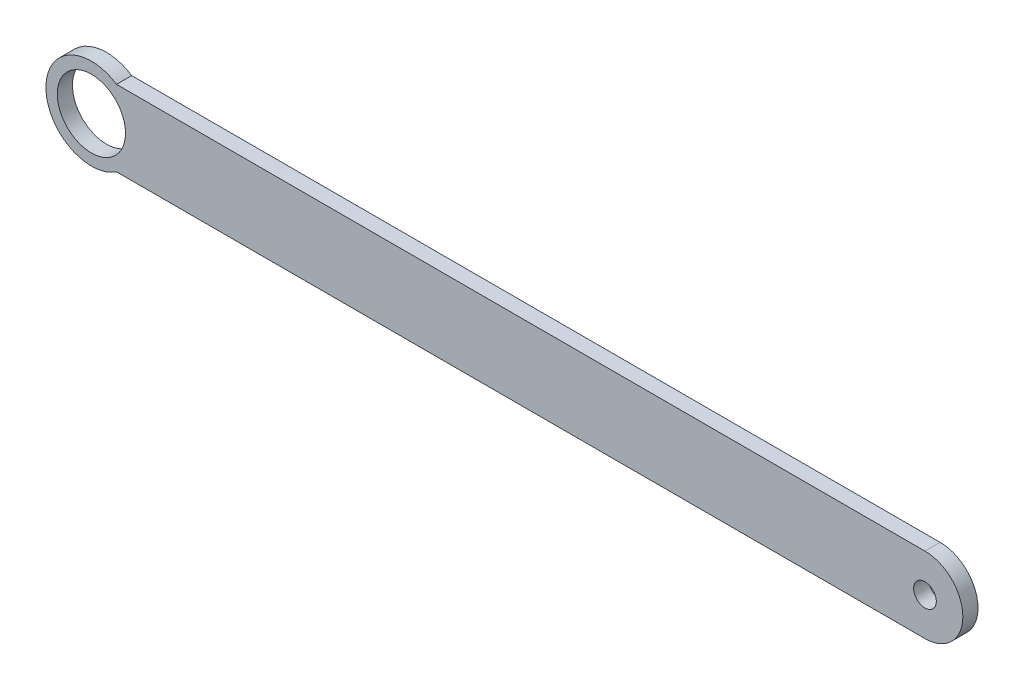
ISO-10303-21;
HEADER;
FILE_DESCRIPTION(('STEP AP214'),'2;1');
FILE_NAME('part.step','',(''),(''),'','','');
FILE_SCHEMA(('AUTOMOTIVE_DESIGN { 1 0 10303 214 1 1 1 1 }'));
ENDSEC;
DATA;
#1=APPLICATION_CONTEXT('core data for automotive mechanical design processes');
#2=APPLICATION_PROTOCOL_DEFINITION('international standard','automotive_design',2000,#1);
#3=PRODUCT_CONTEXT('',#1,'mechanical');
#4=PRODUCT('Part','Part','',(#3));
#5=PRODUCT_RELATED_PRODUCT_CATEGORY('part','',(#4));
#6=PRODUCT_DEFINITION_FORMATION('','',#4);
#7=PRODUCT_DEFINITION_CONTEXT('part definition',#1,'design');
#8=PRODUCT_DEFINITION('design','',#6,#7);
#9=PRODUCT_DEFINITION_SHAPE('','',#8);
#10=(LENGTH_UNIT() NAMED_UNIT(*) SI_UNIT(.MILLI.,.METRE.));
#11=(NAMED_UNIT(*) PLANE_ANGLE_UNIT() SI_UNIT($,.RADIAN.));
#12=(NAMED_UNIT(*) SI_UNIT($,.STERADIAN.) SOLID_ANGLE_UNIT());
#13=UNCERTAINTY_MEASURE_WITH_UNIT(LENGTH_MEASURE(1.E-05),#10,'distance_accuracy_value','');
#14=(GEOMETRIC_REPRESENTATION_CONTEXT(3) GLOBAL_UNCERTAINTY_ASSIGNED_CONTEXT((#13)) GLOBAL_UNIT_ASSIGNED_CONTEXT((#10,
#11,#12)) REPRESENTATION_CONTEXT('',''));
#15=CARTESIAN_POINT('',(0.,0.,0.));
#16=DIRECTION('',(0.,0.,1.));
#17=DIRECTION('',(1.,0.,0.));
#18=AXIS2_PLACEMENT_3D('',#15,#16,#17);
#19=CARTESIAN_POINT('',(9.73390781831E-06,1.23811E-11,2.));
#20=DIRECTION('',(0.,0.,1.));
#21=DIRECTION('',(1.,0.,0.));
#22=AXIS2_PLACEMENT_3D('',#19,#20,#21);
#23=PLANE('',#22);
#24=CARTESIAN_POINT('',(-55.,0.,2.));
#25=DIRECTION('',(0.,0.,1.));
#26=DIRECTION('',(1.,0.,0.));
#27=AXIS2_PLACEMENT_3D('',#24,#25,#26);
#28=CIRCLE('',#27,4.5);
#29=CARTESIAN_POINT('',(-50.5,0.,2.));
#30=VERTEX_POINT('',#29);
#31=EDGE_CURVE('E106',#30,#30,#28,.T.);
#32=ORIENTED_EDGE('',*,*,#31,.F.);
#33=EDGE_LOOP('',(#32));
#34=FACE_BOUND('',#33,.T.);
#35=DIRECTION('',(1.,0.,0.));
#36=VECTOR('',#35,1.);
#37=CARTESIAN_POINT('',(-54.99998271028,5.,2.));
#38=LINE('',#37,#36);
#39=CARTESIAN_POINT('',(-51.6833752096446,5.,2.));
#40=VERTEX_POINT('',#39);
#41=CARTESIAN_POINT('',(55.000017289718,5.,2.));
#42=VERTEX_POINT('',#41);
#43=EDGE_CURVE('E87',#40,#42,#38,.T.);
#44=ORIENTED_EDGE('',*,*,#43,.F.);
#45=CARTESIAN_POINT('',(-55.,0.,2.));
#46=DIRECTION('',(0.,0.,1.));
#47=DIRECTION('',(1.,0.,0.));
#48=AXIS2_PLACEMENT_3D('',#45,#46,#47);
#49=CIRCLE('',#48,5.99999999999999);
#50=CARTESIAN_POINT('',(-51.6833752095994,-4.99999999997,2.));
#51=VERTEX_POINT('',#50);
#52=EDGE_CURVE('E91',#40,#51,#49,.T.);
#53=ORIENTED_EDGE('',*,*,#52,.T.);
#54=DIRECTION('',(1.,0.,0.));
#55=VECTOR('',#54,1.);
#56=CARTESIAN_POINT('',(-54.99998271027,-4.99999999997,2.));
#57=LINE('',#56,#55);
#58=CARTESIAN_POINT('',(55.000017289727,-4.999999999985,2.));
#59=VERTEX_POINT('',#58);
#60=EDGE_CURVE('E57',#51,#59,#57,.T.);
#61=ORIENTED_EDGE('',*,*,#60,.T.);
#62=CARTESIAN_POINT('',(55.000017338002,0.,2.));
#63=DIRECTION('',(0.,0.,1.));
#64=DIRECTION('',(1.,0.,0.));
#65=AXIS2_PLACEMENT_3D('',#62,#63,#64);
#66=CIRCLE('',#65,5.);
#67=EDGE_CURVE('E93',#59,#42,#66,.T.);
#68=ORIENTED_EDGE('',*,*,#67,.T.);
#69=EDGE_LOOP('',(#44,#53,#61,#68));
#70=FACE_BOUND('',#69,.T.);
#71=CARTESIAN_POINT('',(55.000017338002,0.,2.));
#72=DIRECTION('',(0.,0.,1.));
#73=DIRECTION('',(1.,0.,0.));
#74=AXIS2_PLACEMENT_3D('',#71,#72,#73);
#75=CIRCLE('',#74,1.5);
#76=CARTESIAN_POINT('',(56.500017338002,0.,2.));
#77=VERTEX_POINT('',#76);
#78=EDGE_CURVE('E118',#77,#77,#75,.T.);
#79=ORIENTED_EDGE('',*,*,#78,.F.);
#80=EDGE_LOOP('',(#79));
#81=FACE_BOUND('',#80,.T.);
#82=ADVANCED_FACE('F42',(#34,#70,#81),#23,.T.);
#83=CARTESIAN_POINT('',(9.73390781831E-06,1.23811E-11,0.));
#84=DIRECTION('',(0.,0.,1.));
#85=DIRECTION('',(1.,0.,0.));
#86=AXIS2_PLACEMENT_3D('',#83,#84,#85);
#87=PLANE('',#86);
#88=CARTESIAN_POINT('',(-55.,0.,0.));
#89=DIRECTION('',(0.,0.,1.));
#90=DIRECTION('',(1.,0.,0.));
#91=AXIS2_PLACEMENT_3D('',#88,#89,#90);
#92=CIRCLE('',#91,4.5);
#93=CARTESIAN_POINT('',(-50.5,0.,0.));
#94=VERTEX_POINT('',#93);
#95=EDGE_CURVE('E110',#94,#94,#92,.T.);
#96=ORIENTED_EDGE('',*,*,#95,.T.);
#97=EDGE_LOOP('',(#96));
#98=FACE_BOUND('',#97,.T.);
#99=CARTESIAN_POINT('',(55.000017338002,0.,0.));
#100=DIRECTION('',(0.,0.,1.));
#101=DIRECTION('',(1.,0.,0.));
#102=AXIS2_PLACEMENT_3D('',#99,#100,#101);
#103=CIRCLE('',#102,1.5);
#104=CARTESIAN_POINT('',(56.500017338002,0.,0.));
#105=VERTEX_POINT('',#104);
#106=EDGE_CURVE('E50',#105,#105,#103,.T.);
#107=ORIENTED_EDGE('',*,*,#106,.T.);
#108=EDGE_LOOP('',(#107));
#109=FACE_BOUND('',#108,.T.);
#110=DIRECTION('',(1.,0.,0.));
#111=VECTOR('',#110,1.);
#112=CARTESIAN_POINT('',(-54.99998271027,-4.99999999997,0.));
#113=LINE('',#112,#111);
#114=CARTESIAN_POINT('',(-51.6833752095994,-4.99999999997,0.));
#115=VERTEX_POINT('',#114);
#116=CARTESIAN_POINT('',(55.000017289727,-4.999999999985,0.));
#117=VERTEX_POINT('',#116);
#118=EDGE_CURVE('E115',#115,#117,#113,.T.);
#119=ORIENTED_EDGE('',*,*,#118,.F.);
#120=CARTESIAN_POINT('',(-55.,0.,0.));
#121=DIRECTION('',(0.,0.,1.));
#122=DIRECTION('',(1.,0.,0.));
#123=AXIS2_PLACEMENT_3D('',#120,#121,#122);
#124=CIRCLE('',#123,5.99999999999999);
#125=CARTESIAN_POINT('',(-51.6833752096446,5.,0.));
#126=VERTEX_POINT('',#125);
#127=EDGE_CURVE('E105',#126,#115,#124,.T.);
#128=ORIENTED_EDGE('',*,*,#127,.F.);
#129=DIRECTION('',(1.,0.,0.));
#130=VECTOR('',#129,1.);
#131=CARTESIAN_POINT('',(-54.99998271028,5.,0.));
#132=LINE('',#131,#130);
#133=CARTESIAN_POINT('',(55.000017289718,5.,0.));
#134=VERTEX_POINT('',#133);
#135=EDGE_CURVE('E97',#126,#134,#132,.T.);
#136=ORIENTED_EDGE('',*,*,#135,.T.);
#137=CARTESIAN_POINT('',(55.000017338002,0.,0.));
#138=DIRECTION('',(0.,0.,1.));
#139=DIRECTION('',(1.,0.,0.));
#140=AXIS2_PLACEMENT_3D('',#137,#138,#139);
#141=CIRCLE('',#140,5.);
#142=EDGE_CURVE('E114',#117,#134,#141,.T.);
#143=ORIENTED_EDGE('',*,*,#142,.F.);
#144=EDGE_LOOP('',(#119,#128,#136,#143));
#145=FACE_BOUND('',#144,.T.);
#146=ADVANCED_FACE('F134',(#98,#109,#145),#87,.F.);
#147=CARTESIAN_POINT('',(55.000017338002,0.,0.));
#148=DIRECTION('',(0.,0.,-1.));
#149=DIRECTION('',(1.,0.,0.));
#150=AXIS2_PLACEMENT_3D('',#147,#148,#149);
#151=CYLINDRICAL_SURFACE('',#150,1.5);
#152=DIRECTION('',(0.,0.,1.));
#153=VECTOR('',#152,1.);
#154=CARTESIAN_POINT('',(56.500017338002,0.,0.));
#155=LINE('',#154,#153);
#156=EDGE_CURVE('E119',#105,#77,#155,.T.);
#157=ORIENTED_EDGE('',*,*,#156,.T.);
#158=ORIENTED_EDGE('',*,*,#78,.T.);
#159=ORIENTED_EDGE('',*,*,#156,.F.);
#160=ORIENTED_EDGE('',*,*,#106,.F.);
#161=EDGE_LOOP('',(#157,#158,#159,#160));
#162=FACE_BOUND('',#161,.T.);
#163=ADVANCED_FACE('F44',(#162),#151,.F.);
#164=CARTESIAN_POINT('',(-54.99998271027,-4.99999999997,0.));
#165=DIRECTION('',(0.,1.,0.));
#166=DIRECTION('',(1.,0.,0.));
#167=AXIS2_PLACEMENT_3D('',#164,#165,#166);
#168=PLANE('',#167);
#169=ORIENTED_EDGE('',*,*,#60,.F.);
#170=DIRECTION('',(0.,0.,1.));
#171=VECTOR('',#170,1.);
#172=CARTESIAN_POINT('',(-51.6833752095994,-4.99999999997,0.));
#173=LINE('',#172,#171);
#174=EDGE_CURVE('E61',#51,#115,#173,.F.);
#175=ORIENTED_EDGE('',*,*,#174,.T.);
#176=ORIENTED_EDGE('',*,*,#118,.T.);
#177=DIRECTION('',(0.,0.,1.));
#178=VECTOR('',#177,1.);
#179=CARTESIAN_POINT('',(55.000017289727,-4.999999999985,0.));
#180=LINE('',#179,#178);
#181=EDGE_CURVE('E98',#117,#59,#180,.T.);
#182=ORIENTED_EDGE('',*,*,#181,.T.);
#183=EDGE_LOOP('',(#169,#175,#176,#182));
#184=FACE_BOUND('',#183,.T.);
#185=ADVANCED_FACE('F135',(#184),#168,.F.);
#186=CARTESIAN_POINT('',(-54.99998271028,5.,0.));
#187=DIRECTION('',(0.,1.,0.));
#188=DIRECTION('',(1.,0.,0.));
#189=AXIS2_PLACEMENT_3D('',#186,#187,#188);
#190=PLANE('',#189);
#191=DIRECTION('',(0.,0.,1.));
#192=VECTOR('',#191,1.);
#193=CARTESIAN_POINT('',(-51.6833752096446,5.,0.));
#194=LINE('',#193,#192);
#195=EDGE_CURVE('E11',#40,#126,#194,.F.);
#196=ORIENTED_EDGE('',*,*,#195,.F.);
#197=ORIENTED_EDGE('',*,*,#43,.T.);
#198=DIRECTION('',(0.,0.,1.));
#199=VECTOR('',#198,1.);
#200=CARTESIAN_POINT('',(55.000017289718,5.,0.));
#201=LINE('',#200,#199);
#202=EDGE_CURVE('E127',#134,#42,#201,.T.);
#203=ORIENTED_EDGE('',*,*,#202,.F.);
#204=ORIENTED_EDGE('',*,*,#135,.F.);
#205=EDGE_LOOP('',(#196,#197,#203,#204));
#206=FACE_BOUND('',#205,.T.);
#207=ADVANCED_FACE('F100',(#206),#190,.T.);
#208=CARTESIAN_POINT('',(55.000017338002,0.,0.));
#209=DIRECTION('',(0.,0.,-1.));
#210=DIRECTION('',(1.,0.,0.));
#211=AXIS2_PLACEMENT_3D('',#208,#209,#210);
#212=CYLINDRICAL_SURFACE('',#211,5.);
#213=ORIENTED_EDGE('',*,*,#142,.T.);
#214=ORIENTED_EDGE('',*,*,#202,.T.);
#215=ORIENTED_EDGE('',*,*,#67,.F.);
#216=ORIENTED_EDGE('',*,*,#181,.F.);
#217=EDGE_LOOP('',(#213,#214,#215,#216));
#218=FACE_BOUND('',#217,.T.);
#219=ADVANCED_FACE('F130',(#218),#212,.T.);
#220=CARTESIAN_POINT('',(-55.,0.,0.));
#221=DIRECTION('',(0.,0.,1.));
#222=DIRECTION('',(1.,0.,0.));
#223=AXIS2_PLACEMENT_3D('',#220,#221,#222);
#224=CYLINDRICAL_SURFACE('',#223,5.99999999999999);
#225=ORIENTED_EDGE('',*,*,#174,.F.);
#226=ORIENTED_EDGE('',*,*,#52,.F.);
#227=ORIENTED_EDGE('',*,*,#195,.T.);
#228=ORIENTED_EDGE('',*,*,#127,.T.);
#229=EDGE_LOOP('',(#225,#226,#227,#228));
#230=FACE_BOUND('',#229,.T.);
#231=ADVANCED_FACE('F104',(#230),#224,.T.);
#232=CARTESIAN_POINT('',(-55.,0.,0.));
#233=DIRECTION('',(0.,0.,1.));
#234=DIRECTION('',(1.,0.,0.));
#235=AXIS2_PLACEMENT_3D('',#232,#233,#234);
#236=CYLINDRICAL_SURFACE('',#235,4.5);
#237=ORIENTED_EDGE('',*,*,#31,.T.);
#238=EDGE_LOOP('',(#237));
#239=FACE_BOUND('',#238,.T.);
#240=ORIENTED_EDGE('',*,*,#95,.F.);
#241=EDGE_LOOP('',(#240));
#242=FACE_BOUND('',#241,.T.);
#243=ADVANCED_FACE('F159',(#239,#242),#236,.F.);
#244=CLOSED_SHELL('',(#82,#146,#163,#185,#207,#219,#231,#243));
#245=MANIFOLD_SOLID_BREP('B2',#244);
#246=ADVANCED_BREP_SHAPE_REPRESENTATION('',(#18,#245),#14);
#247=SHAPE_DEFINITION_REPRESENTATION(#9,#246);
ENDSEC;
END-ISO-10303-21;
